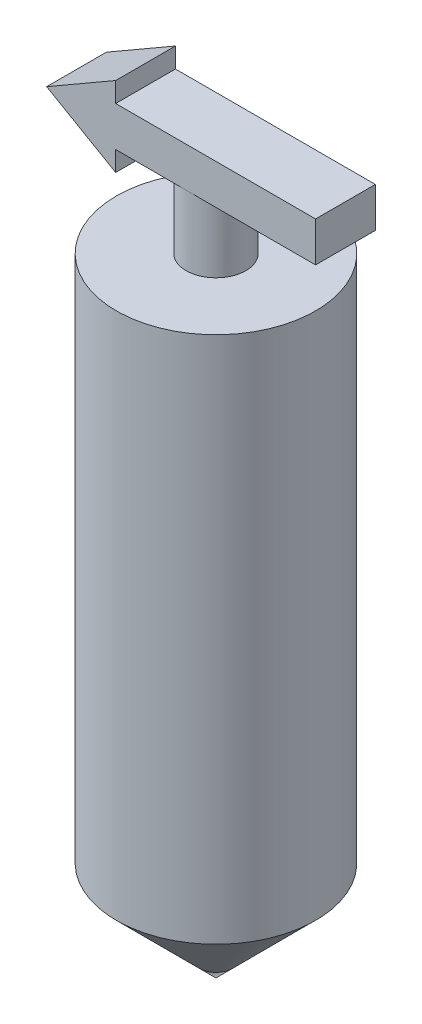
ISO-10303-21;
HEADER;
FILE_DESCRIPTION(('STEP AP214'),'2;1');
FILE_NAME('part.step','',(''),(''),'','','');
FILE_SCHEMA(('AUTOMOTIVE_DESIGN { 1 0 10303 214 1 1 1 1 }'));
ENDSEC;
DATA;
#1=APPLICATION_CONTEXT('core data for automotive mechanical design processes');
#2=APPLICATION_PROTOCOL_DEFINITION('international standard','automotive_design',2000,#1);
#3=PRODUCT_CONTEXT('',#1,'mechanical');
#4=PRODUCT('Part','Part','',(#3));
#5=PRODUCT_RELATED_PRODUCT_CATEGORY('part','',(#4));
#6=PRODUCT_DEFINITION_FORMATION('','',#4);
#7=PRODUCT_DEFINITION_CONTEXT('part definition',#1,'design');
#8=PRODUCT_DEFINITION('design','',#6,#7);
#9=PRODUCT_DEFINITION_SHAPE('','',#8);
#10=(LENGTH_UNIT() NAMED_UNIT(*) SI_UNIT(.MILLI.,.METRE.));
#11=(NAMED_UNIT(*) PLANE_ANGLE_UNIT() SI_UNIT($,.RADIAN.));
#12=(NAMED_UNIT(*) SI_UNIT($,.STERADIAN.) SOLID_ANGLE_UNIT());
#13=UNCERTAINTY_MEASURE_WITH_UNIT(LENGTH_MEASURE(1.E-05),#10,'distance_accuracy_value','');
#14=(GEOMETRIC_REPRESENTATION_CONTEXT(3) GLOBAL_UNCERTAINTY_ASSIGNED_CONTEXT((#13)) GLOBAL_UNIT_ASSIGNED_CONTEXT((#10,
#11,#12)) REPRESENTATION_CONTEXT('',''));
#15=CARTESIAN_POINT('',(0.,0.,0.));
#16=DIRECTION('',(0.,0.,1.));
#17=DIRECTION('',(1.,0.,0.));
#18=AXIS2_PLACEMENT_3D('',#15,#16,#17);
#19=CARTESIAN_POINT('',(0.,0.,0.));
#20=DIRECTION('',(0.,1.,0.));
#21=DIRECTION('',(-1.,0.,0.));
#22=AXIS2_PLACEMENT_3D('',#19,#20,#21);
#23=CONICAL_SURFACE('',#22,0.,0.785398163397443);
#24=CARTESIAN_POINT('',(0.,10.0000000000001,0.));
#25=DIRECTION('',(0.,1.,0.));
#26=DIRECTION('',(-1.,0.,0.));
#27=AXIS2_PLACEMENT_3D('',#24,#25,#26);
#28=CIRCLE('',#27,10.);
#29=CARTESIAN_POINT('',(-10.,10.0000000000001,0.));
#30=VERTEX_POINT('',#29);
#31=EDGE_CURVE('E11',#30,#30,#28,.T.);
#32=ORIENTED_EDGE('',*,*,#31,.F.);
#33=EDGE_LOOP('',(#32));
#34=FACE_BOUND('',#33,.T.);
#35=CARTESIAN_POINT('',(0.,0.,0.));
#36=VERTEX_POINT('',#35);
#37=VERTEX_LOOP('',#36);
#38=FACE_BOUND('',#37,.T.);
#39=ADVANCED_FACE('F39',(#34,#38),#23,.T.);
#40=CARTESIAN_POINT('',(0.,70.,0.));
#41=DIRECTION('',(0.,1.,0.));
#42=DIRECTION('',(-1.,0.,0.));
#43=AXIS2_PLACEMENT_3D('',#40,#41,#42);
#44=CYLINDRICAL_SURFACE('',#43,10.);
#45=CARTESIAN_POINT('',(0.,63.,0.));
#46=DIRECTION('',(0.,1.,0.));
#47=DIRECTION('',(-1.,0.,0.));
#48=AXIS2_PLACEMENT_3D('',#45,#46,#47);
#49=CIRCLE('',#48,10.);
#50=CARTESIAN_POINT('',(-10.,63.,0.));
#51=VERTEX_POINT('',#50);
#52=EDGE_CURVE('E47',#51,#51,#49,.T.);
#53=ORIENTED_EDGE('',*,*,#52,.F.);
#54=EDGE_LOOP('',(#53));
#55=FACE_BOUND('',#54,.T.);
#56=ORIENTED_EDGE('',*,*,#31,.T.);
#57=EDGE_LOOP('',(#56));
#58=FACE_BOUND('',#57,.T.);
#59=ADVANCED_FACE('F151',(#55,#58),#44,.T.);
#60=CARTESIAN_POINT('',(9.99999999999999,63.,0.));
#61=DIRECTION('',(0.,-1.,0.));
#62=DIRECTION('',(1.,0.,0.));
#63=AXIS2_PLACEMENT_3D('',#60,#61,#62);
#64=PLANE('',#63);
#65=CARTESIAN_POINT('',(0.,63.,0.));
#66=DIRECTION('',(0.,1.,0.));
#67=DIRECTION('',(-1.,0.,0.));
#68=AXIS2_PLACEMENT_3D('',#65,#66,#67);
#69=CIRCLE('',#68,3.);
#70=CARTESIAN_POINT('',(-3.,63.,0.));
#71=VERTEX_POINT('',#70);
#72=EDGE_CURVE('E142',#71,#71,#69,.T.);
#73=ORIENTED_EDGE('',*,*,#72,.F.);
#74=EDGE_LOOP('',(#73));
#75=FACE_BOUND('',#74,.T.);
#76=ORIENTED_EDGE('',*,*,#52,.T.);
#77=EDGE_LOOP('',(#76));
#78=FACE_BOUND('',#77,.T.);
#79=ADVANCED_FACE('F149',(#75,#78),#64,.F.);
#80=CARTESIAN_POINT('',(0.,70.,0.));
#81=DIRECTION('',(0.,1.,0.));
#82=DIRECTION('',(-1.,0.,0.));
#83=AXIS2_PLACEMENT_3D('',#80,#81,#82);
#84=CYLINDRICAL_SURFACE('',#83,3.);
#85=CARTESIAN_POINT('',(0.,70.,0.));
#86=DIRECTION('',(0.,1.,0.));
#87=DIRECTION('',(-1.,0.,0.));
#88=AXIS2_PLACEMENT_3D('',#85,#86,#87);
#89=CIRCLE('',#88,3.);
#90=CARTESIAN_POINT('',(0.,70.,3.));
#91=VERTEX_POINT('',#90);
#92=CARTESIAN_POINT('',(0.,70.,-3.));
#93=VERTEX_POINT('',#92);
#94=EDGE_CURVE('E135',#91,#93,#89,.T.);
#95=ORIENTED_EDGE('',*,*,#94,.F.);
#96=EDGE_CURVE('E53',#93,#91,#89,.T.);
#97=ORIENTED_EDGE('',*,*,#96,.F.);
#98=EDGE_LOOP('',(#95,#97));
#99=FACE_BOUND('',#98,.T.);
#100=ORIENTED_EDGE('',*,*,#72,.T.);
#101=EDGE_LOOP('',(#100));
#102=FACE_BOUND('',#101,.T.);
#103=ADVANCED_FACE('F169',(#99,#102),#84,.T.);
#104=CARTESIAN_POINT('',(-7.0717967697244,70.,3.));
#105=DIRECTION('',(0.,1.,0.));
#106=DIRECTION('',(0.,0.,1.));
#107=AXIS2_PLACEMENT_3D('',#104,#105,#106);
#108=PLANE('',#107);
#109=DIRECTION('',(1.,0.,0.));
#110=VECTOR('',#109,1.);
#111=CARTESIAN_POINT('',(-7.0717967697244,70.,3.));
#112=LINE('',#111,#110);
#113=CARTESIAN_POINT('',(13.,70.,3.));
#114=VERTEX_POINT('',#113);
#115=EDGE_CURVE('E334',#91,#114,#112,.T.);
#116=ORIENTED_EDGE('',*,*,#115,.F.);
#117=ORIENTED_EDGE('',*,*,#94,.T.);
#118=DIRECTION('',(1.,0.,0.));
#119=VECTOR('',#118,1.);
#120=CARTESIAN_POINT('',(-7.0717967697244,70.,-3.));
#121=LINE('',#120,#119);
#122=CARTESIAN_POINT('',(13.,70.,-3.));
#123=VERTEX_POINT('',#122);
#124=EDGE_CURVE('E294',#93,#123,#121,.T.);
#125=ORIENTED_EDGE('',*,*,#124,.T.);
#126=DIRECTION('',(0.,0.,-1.));
#127=VECTOR('',#126,1.);
#128=CARTESIAN_POINT('',(13.,70.,3.));
#129=LINE('',#128,#127);
#130=EDGE_CURVE('E318',#114,#123,#129,.T.);
#131=ORIENTED_EDGE('',*,*,#130,.F.);
#132=EDGE_LOOP('',(#116,#117,#125,#131));
#133=FACE_BOUND('',#132,.T.);
#134=ADVANCED_FACE('F177',(#133),#108,.F.);
#135=CARTESIAN_POINT('',(-14.,72.,3.));
#136=DIRECTION('',(0.499999999999995,-0.866025403784442,0.));
#137=DIRECTION('',(0.866025403784442,0.499999999999995,0.));
#138=AXIS2_PLACEMENT_3D('',#135,#136,#137);
#139=PLANE('',#138);
#140=DIRECTION('',(-0.866025403784442,-0.499999999999995,0.));
#141=VECTOR('',#140,1.);
#142=CARTESIAN_POINT('',(-14.,72.,-3.));
#143=LINE('',#142,#141);
#144=CARTESIAN_POINT('',(-7.07179676972438,76.,-3.));
#145=VERTEX_POINT('',#144);
#146=CARTESIAN_POINT('',(-14.,72.,-3.));
#147=VERTEX_POINT('',#146);
#148=EDGE_CURVE('E130',#145,#147,#143,.T.);
#149=ORIENTED_EDGE('',*,*,#148,.T.);
#150=DIRECTION('',(0.,0.,-1.));
#151=VECTOR('',#150,1.);
#152=CARTESIAN_POINT('',(-14.,72.,3.));
#153=LINE('',#152,#151);
#154=CARTESIAN_POINT('',(-14.,72.,3.));
#155=VERTEX_POINT('',#154);
#156=EDGE_CURVE('E108',#155,#147,#153,.T.);
#157=ORIENTED_EDGE('',*,*,#156,.F.);
#158=DIRECTION('',(-0.866025403784442,-0.499999999999995,0.));
#159=VECTOR('',#158,1.);
#160=CARTESIAN_POINT('',(-14.,72.,3.));
#161=LINE('',#160,#159);
#162=CARTESIAN_POINT('',(-7.07179676972438,76.,3.));
#163=VERTEX_POINT('',#162);
#164=EDGE_CURVE('E116',#163,#155,#161,.T.);
#165=ORIENTED_EDGE('',*,*,#164,.F.);
#166=DIRECTION('',(0.,0.,-1.));
#167=VECTOR('',#166,1.);
#168=CARTESIAN_POINT('',(-7.07179676972438,76.,3.));
#169=LINE('',#168,#167);
#170=EDGE_CURVE('E307',#163,#145,#169,.T.);
#171=ORIENTED_EDGE('',*,*,#170,.T.);
#172=EDGE_LOOP('',(#149,#157,#165,#171));
#173=FACE_BOUND('',#172,.T.);
#174=ADVANCED_FACE('F128',(#173),#139,.F.);
#175=CARTESIAN_POINT('',(-14.,72.,3.));
#176=DIRECTION('',(0.499999999999995,0.866025403784442,0.));
#177=DIRECTION('',(-0.866025403784442,0.499999999999995,0.));
#178=AXIS2_PLACEMENT_3D('',#175,#176,#177);
#179=PLANE('',#178);
#180=DIRECTION('',(0.866025403784442,-0.499999999999995,0.));
#181=VECTOR('',#180,1.);
#182=CARTESIAN_POINT('',(-14.,72.,-3.));
#183=LINE('',#182,#181);
#184=CARTESIAN_POINT('',(-7.07179676972438,68.,-3.));
#185=VERTEX_POINT('',#184);
#186=EDGE_CURVE('E283',#147,#185,#183,.T.);
#187=ORIENTED_EDGE('',*,*,#186,.T.);
#188=DIRECTION('',(0.,0.,-1.));
#189=VECTOR('',#188,1.);
#190=CARTESIAN_POINT('',(-7.07179676972438,68.,3.));
#191=LINE('',#190,#189);
#192=CARTESIAN_POINT('',(-7.07179676972438,68.,3.));
#193=VERTEX_POINT('',#192);
#194=EDGE_CURVE('E111',#193,#185,#191,.T.);
#195=ORIENTED_EDGE('',*,*,#194,.F.);
#196=DIRECTION('',(0.866025403784442,-0.499999999999995,0.));
#197=VECTOR('',#196,1.);
#198=CARTESIAN_POINT('',(-14.,72.,3.));
#199=LINE('',#198,#197);
#200=EDGE_CURVE('E104',#155,#193,#199,.T.);
#201=ORIENTED_EDGE('',*,*,#200,.F.);
#202=ORIENTED_EDGE('',*,*,#156,.T.);
#203=EDGE_LOOP('',(#187,#195,#201,#202));
#204=FACE_BOUND('',#203,.T.);
#205=ADVANCED_FACE('F106',(#204),#179,.F.);
#206=CARTESIAN_POINT('',(-7.07179676972438,68.,3.));
#207=DIRECTION('',(-1.,0.,0.));
#208=DIRECTION('',(0.,-1.,0.));
#209=AXIS2_PLACEMENT_3D('',#206,#207,#208);
#210=PLANE('',#209);
#211=DIRECTION('',(0.,1.,0.));
#212=VECTOR('',#211,1.);
#213=CARTESIAN_POINT('',(-7.07179676972438,68.,-3.));
#214=LINE('',#213,#212);
#215=CARTESIAN_POINT('',(-7.0717967697244,70.,-3.));
#216=VERTEX_POINT('',#215);
#217=EDGE_CURVE('E287',#185,#216,#214,.T.);
#218=ORIENTED_EDGE('',*,*,#217,.T.);
#219=DIRECTION('',(0.,0.,-1.));
#220=VECTOR('',#219,1.);
#221=CARTESIAN_POINT('',(-7.0717967697244,70.,3.));
#222=LINE('',#221,#220);
#223=CARTESIAN_POINT('',(-7.0717967697244,70.,3.));
#224=VERTEX_POINT('',#223);
#225=EDGE_CURVE('E137',#224,#216,#222,.T.);
#226=ORIENTED_EDGE('',*,*,#225,.F.);
#227=DIRECTION('',(0.,1.,0.));
#228=VECTOR('',#227,1.);
#229=CARTESIAN_POINT('',(-7.07179676972438,68.,3.));
#230=LINE('',#229,#228);
#231=EDGE_CURVE('E115',#193,#224,#230,.T.);
#232=ORIENTED_EDGE('',*,*,#231,.F.);
#233=ORIENTED_EDGE('',*,*,#194,.T.);
#234=EDGE_LOOP('',(#218,#226,#232,#233));
#235=FACE_BOUND('',#234,.T.);
#236=ADVANCED_FACE('F198',(#235),#210,.F.);
#237=EDGE_CURVE('E295',#216,#93,#121,.T.);
#238=ORIENTED_EDGE('',*,*,#237,.T.);
#239=ORIENTED_EDGE('',*,*,#96,.T.);
#240=EDGE_CURVE('E327',#224,#91,#112,.T.);
#241=ORIENTED_EDGE('',*,*,#240,.F.);
#242=ORIENTED_EDGE('',*,*,#225,.T.);
#243=EDGE_LOOP('',(#238,#239,#241,#242));
#244=FACE_BOUND('',#243,.T.);
#245=ADVANCED_FACE('F186',(#244),#108,.F.);
#246=CARTESIAN_POINT('',(13.,70.,3.));
#247=DIRECTION('',(-1.,0.,0.));
#248=DIRECTION('',(0.,0.,1.));
#249=AXIS2_PLACEMENT_3D('',#246,#247,#248);
#250=PLANE('',#249);
#251=DIRECTION('',(0.,1.,0.));
#252=VECTOR('',#251,1.);
#253=CARTESIAN_POINT('',(13.,70.,-3.));
#254=LINE('',#253,#252);
#255=CARTESIAN_POINT('',(13.,74.,-3.));
#256=VERTEX_POINT('',#255);
#257=EDGE_CURVE('E299',#123,#256,#254,.T.);
#258=ORIENTED_EDGE('',*,*,#257,.T.);
#259=DIRECTION('',(0.,0.,-1.));
#260=VECTOR('',#259,1.);
#261=CARTESIAN_POINT('',(13.,74.,3.));
#262=LINE('',#261,#260);
#263=CARTESIAN_POINT('',(13.,74.,3.));
#264=VERTEX_POINT('',#263);
#265=EDGE_CURVE('E314',#264,#256,#262,.T.);
#266=ORIENTED_EDGE('',*,*,#265,.F.);
#267=DIRECTION('',(0.,1.,0.));
#268=VECTOR('',#267,1.);
#269=CARTESIAN_POINT('',(13.,70.,3.));
#270=LINE('',#269,#268);
#271=EDGE_CURVE('E339',#114,#264,#270,.T.);
#272=ORIENTED_EDGE('',*,*,#271,.F.);
#273=ORIENTED_EDGE('',*,*,#130,.T.);
#274=EDGE_LOOP('',(#258,#266,#272,#273));
#275=FACE_BOUND('',#274,.T.);
#276=ADVANCED_FACE('F212',(#275),#250,.F.);
#277=CARTESIAN_POINT('',(-7.0717967697244,74.,3.));
#278=DIRECTION('',(0.,-1.,0.));
#279=DIRECTION('',(0.,0.,-1.));
#280=AXIS2_PLACEMENT_3D('',#277,#278,#279);
#281=PLANE('',#280);
#282=DIRECTION('',(-1.,0.,0.));
#283=VECTOR('',#282,1.);
#284=CARTESIAN_POINT('',(-7.0717967697244,74.,-3.));
#285=LINE('',#284,#283);
#286=CARTESIAN_POINT('',(-7.0717967697244,74.,-3.));
#287=VERTEX_POINT('',#286);
#288=EDGE_CURVE('E302',#256,#287,#285,.T.);
#289=ORIENTED_EDGE('',*,*,#288,.T.);
#290=DIRECTION('',(0.,0.,-1.));
#291=VECTOR('',#290,1.);
#292=CARTESIAN_POINT('',(-7.0717967697244,74.,3.));
#293=LINE('',#292,#291);
#294=CARTESIAN_POINT('',(-7.0717967697244,74.,3.));
#295=VERTEX_POINT('',#294);
#296=EDGE_CURVE('E310',#295,#287,#293,.T.);
#297=ORIENTED_EDGE('',*,*,#296,.F.);
#298=DIRECTION('',(-1.,0.,0.));
#299=VECTOR('',#298,1.);
#300=CARTESIAN_POINT('',(-7.0717967697244,74.,3.));
#301=LINE('',#300,#299);
#302=EDGE_CURVE('E341',#264,#295,#301,.T.);
#303=ORIENTED_EDGE('',*,*,#302,.F.);
#304=ORIENTED_EDGE('',*,*,#265,.T.);
#305=EDGE_LOOP('',(#289,#297,#303,#304));
#306=FACE_BOUND('',#305,.T.);
#307=ADVANCED_FACE('F219',(#306),#281,.F.);
#308=CARTESIAN_POINT('',(-7.07179676972438,76.,3.));
#309=DIRECTION('',(-1.,0.,0.));
#310=DIRECTION('',(0.,-1.,0.));
#311=AXIS2_PLACEMENT_3D('',#308,#309,#310);
#312=PLANE('',#311);
#313=DIRECTION('',(0.,1.,0.));
#314=VECTOR('',#313,1.);
#315=CARTESIAN_POINT('',(-7.07179676972438,76.,-3.));
#316=LINE('',#315,#314);
#317=EDGE_CURVE('E126',#287,#145,#316,.T.);
#318=ORIENTED_EDGE('',*,*,#317,.T.);
#319=ORIENTED_EDGE('',*,*,#170,.F.);
#320=DIRECTION('',(0.,1.,0.));
#321=VECTOR('',#320,1.);
#322=CARTESIAN_POINT('',(-7.07179676972438,76.,3.));
#323=LINE('',#322,#321);
#324=EDGE_CURVE('E121',#295,#163,#323,.T.);
#325=ORIENTED_EDGE('',*,*,#324,.F.);
#326=ORIENTED_EDGE('',*,*,#296,.T.);
#327=EDGE_LOOP('',(#318,#319,#325,#326));
#328=FACE_BOUND('',#327,.T.);
#329=ADVANCED_FACE('F227',(#328),#312,.F.);
#330=CARTESIAN_POINT('',(0.,0.,3.));
#331=DIRECTION('',(0.,0.,-1.));
#332=DIRECTION('',(-1.,0.,0.));
#333=AXIS2_PLACEMENT_3D('',#330,#331,#332);
#334=PLANE('',#333);
#335=ORIENTED_EDGE('',*,*,#164,.T.);
#336=ORIENTED_EDGE('',*,*,#200,.T.);
#337=ORIENTED_EDGE('',*,*,#231,.T.);
#338=ORIENTED_EDGE('',*,*,#240,.T.);
#339=ORIENTED_EDGE('',*,*,#115,.T.);
#340=ORIENTED_EDGE('',*,*,#271,.T.);
#341=ORIENTED_EDGE('',*,*,#302,.T.);
#342=ORIENTED_EDGE('',*,*,#324,.T.);
#343=EDGE_LOOP('',(#335,#336,#337,#338,#339,#340,#341,#342));
#344=FACE_BOUND('',#343,.T.);
#345=ADVANCED_FACE('F119',(#344),#334,.F.);
#346=CARTESIAN_POINT('',(0.,0.,-3.));
#347=DIRECTION('',(0.,0.,-1.));
#348=DIRECTION('',(-1.,0.,0.));
#349=AXIS2_PLACEMENT_3D('',#346,#347,#348);
#350=PLANE('',#349);
#351=ORIENTED_EDGE('',*,*,#148,.F.);
#352=ORIENTED_EDGE('',*,*,#317,.F.);
#353=ORIENTED_EDGE('',*,*,#288,.F.);
#354=ORIENTED_EDGE('',*,*,#257,.F.);
#355=ORIENTED_EDGE('',*,*,#124,.F.);
#356=ORIENTED_EDGE('',*,*,#237,.F.);
#357=ORIENTED_EDGE('',*,*,#217,.F.);
#358=ORIENTED_EDGE('',*,*,#186,.F.);
#359=EDGE_LOOP('',(#351,#352,#353,#354,#355,#356,#357,#358));
#360=FACE_BOUND('',#359,.T.);
#361=ADVANCED_FACE('F242',(#360),#350,.T.);
#362=CLOSED_SHELL('',(#39,#59,#79,#103,#134,#174,#205,#236,#245,#276,#307,#329,#345,#361));
#363=MANIFOLD_SOLID_BREP('B2',#362);
#364=ADVANCED_BREP_SHAPE_REPRESENTATION('',(#18,#363),#14);
#365=SHAPE_DEFINITION_REPRESENTATION(#9,#364);
ENDSEC;
END-ISO-10303-21;
